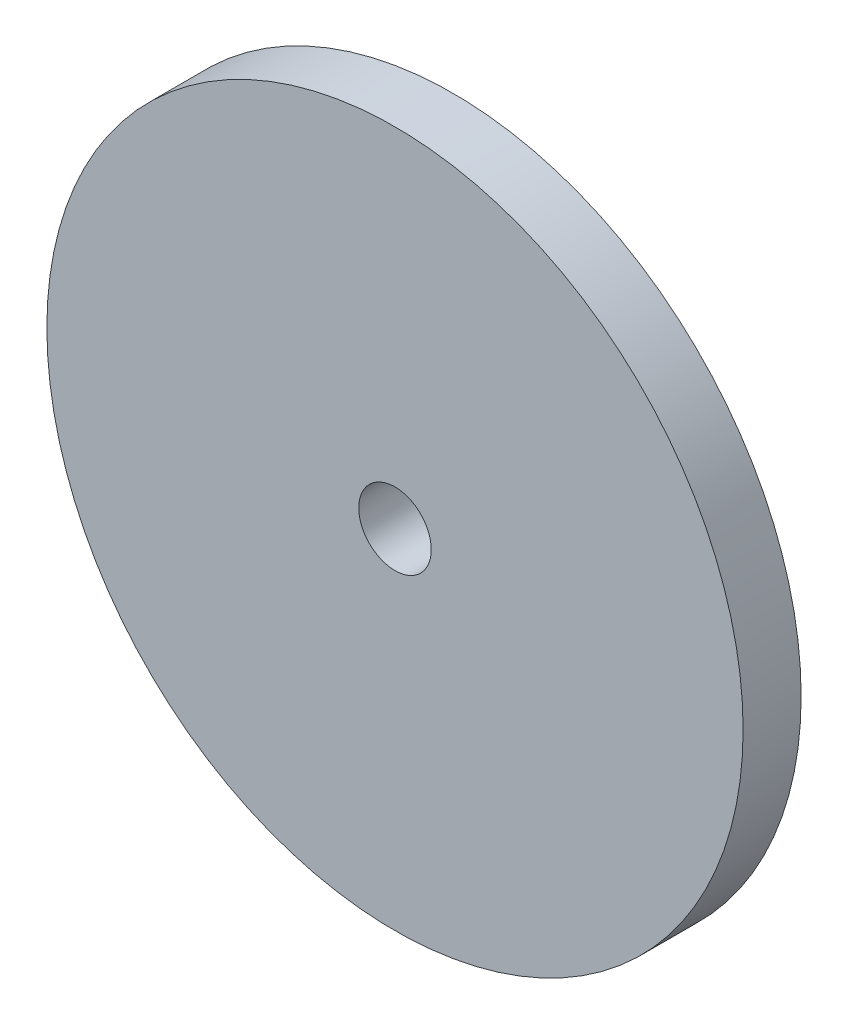
ISO-10303-21;
HEADER;
FILE_DESCRIPTION(('STEP AP214'),'2;1');
FILE_NAME('part.step','',(''),(''),'','','');
FILE_SCHEMA(('AUTOMOTIVE_DESIGN { 1 0 10303 214 1 1 1 1 }'));
ENDSEC;
DATA;
#1=APPLICATION_CONTEXT('core data for automotive mechanical design processes');
#2=APPLICATION_PROTOCOL_DEFINITION('international standard','automotive_design',2000,#1);
#3=PRODUCT_CONTEXT('',#1,'mechanical');
#4=PRODUCT('Part','Part','',(#3));
#5=PRODUCT_RELATED_PRODUCT_CATEGORY('part','',(#4));
#6=PRODUCT_DEFINITION_FORMATION('','',#4);
#7=PRODUCT_DEFINITION_CONTEXT('part definition',#1,'design');
#8=PRODUCT_DEFINITION('design','',#6,#7);
#9=PRODUCT_DEFINITION_SHAPE('','',#8);
#10=(LENGTH_UNIT() NAMED_UNIT(*) SI_UNIT(.MILLI.,.METRE.));
#11=(NAMED_UNIT(*) PLANE_ANGLE_UNIT() SI_UNIT($,.RADIAN.));
#12=(NAMED_UNIT(*) SI_UNIT($,.STERADIAN.) SOLID_ANGLE_UNIT());
#13=UNCERTAINTY_MEASURE_WITH_UNIT(LENGTH_MEASURE(1.E-05),#10,'distance_accuracy_value','');
#14=(GEOMETRIC_REPRESENTATION_CONTEXT(3) GLOBAL_UNCERTAINTY_ASSIGNED_CONTEXT((#13)) GLOBAL_UNIT_ASSIGNED_CONTEXT((#10,
#11,#12)) REPRESENTATION_CONTEXT('',''));
#15=CARTESIAN_POINT('',(0.,0.,0.));
#16=DIRECTION('',(0.,0.,1.));
#17=DIRECTION('',(1.,0.,0.));
#18=AXIS2_PLACEMENT_3D('',#15,#16,#17);
#19=CARTESIAN_POINT('',(0.,0.,5.08));
#20=DIRECTION('',(0.,0.,1.));
#21=DIRECTION('',(1.,0.,0.));
#22=AXIS2_PLACEMENT_3D('',#19,#20,#21);
#23=PLANE('',#22);
#24=CARTESIAN_POINT('',(0.,0.,5.08));
#25=DIRECTION('',(0.,0.,1.));
#26=DIRECTION('',(1.,0.,0.));
#27=AXIS2_PLACEMENT_3D('',#24,#25,#26);
#28=CIRCLE('',#27,30.48);
#29=CARTESIAN_POINT('',(30.48,0.,5.08));
#30=VERTEX_POINT('',#29);
#31=EDGE_CURVE('E10',#30,#30,#28,.T.);
#32=ORIENTED_EDGE('',*,*,#31,.T.);
#33=EDGE_LOOP('',(#32));
#34=FACE_BOUND('',#33,.T.);
#35=CARTESIAN_POINT('',(0.,0.,5.08));
#36=DIRECTION('',(0.,0.,1.));
#37=DIRECTION('',(1.,0.,0.));
#38=AXIS2_PLACEMENT_3D('',#35,#36,#37);
#39=CIRCLE('',#38,3.175);
#40=CARTESIAN_POINT('',(3.175,0.,5.08));
#41=VERTEX_POINT('',#40);
#42=EDGE_CURVE('E39',#41,#41,#39,.T.);
#43=ORIENTED_EDGE('',*,*,#42,.F.);
#44=EDGE_LOOP('',(#43));
#45=FACE_BOUND('',#44,.T.);
#46=ADVANCED_FACE('F28',(#34,#45),#23,.T.);
#47=CARTESIAN_POINT('',(0.,0.,0.));
#48=DIRECTION('',(0.,0.,1.));
#49=DIRECTION('',(1.,0.,0.));
#50=AXIS2_PLACEMENT_3D('',#47,#48,#49);
#51=PLANE('',#50);
#52=CARTESIAN_POINT('',(0.,0.,0.));
#53=DIRECTION('',(0.,0.,1.));
#54=DIRECTION('',(1.,0.,0.));
#55=AXIS2_PLACEMENT_3D('',#52,#53,#54);
#56=CIRCLE('',#55,30.48);
#57=CARTESIAN_POINT('',(30.48,0.,0.));
#58=VERTEX_POINT('',#57);
#59=EDGE_CURVE('E32',#58,#58,#56,.T.);
#60=ORIENTED_EDGE('',*,*,#59,.F.);
#61=EDGE_LOOP('',(#60));
#62=FACE_BOUND('',#61,.T.);
#63=CARTESIAN_POINT('',(0.,0.,0.));
#64=DIRECTION('',(0.,0.,1.));
#65=DIRECTION('',(1.,0.,0.));
#66=AXIS2_PLACEMENT_3D('',#63,#64,#65);
#67=CIRCLE('',#66,3.175);
#68=CARTESIAN_POINT('',(3.175,0.,0.));
#69=VERTEX_POINT('',#68);
#70=EDGE_CURVE('E41',#69,#69,#67,.T.);
#71=ORIENTED_EDGE('',*,*,#70,.T.);
#72=EDGE_LOOP('',(#71));
#73=FACE_BOUND('',#72,.T.);
#74=ADVANCED_FACE('F51',(#62,#73),#51,.F.);
#75=CARTESIAN_POINT('',(0.,0.,5.08));
#76=DIRECTION('',(0.,0.,-1.));
#77=DIRECTION('',(-1.,0.,0.));
#78=AXIS2_PLACEMENT_3D('',#75,#76,#77);
#79=CYLINDRICAL_SURFACE('',#78,30.48);
#80=ORIENTED_EDGE('',*,*,#31,.F.);
#81=EDGE_LOOP('',(#80));
#82=FACE_BOUND('',#81,.T.);
#83=ORIENTED_EDGE('',*,*,#59,.T.);
#84=EDGE_LOOP('',(#83));
#85=FACE_BOUND('',#84,.T.);
#86=ADVANCED_FACE('F30',(#82,#85),#79,.T.);
#87=CARTESIAN_POINT('',(0.,0.,5.08));
#88=DIRECTION('',(0.,0.,-1.));
#89=DIRECTION('',(-1.,0.,0.));
#90=AXIS2_PLACEMENT_3D('',#87,#88,#89);
#91=CYLINDRICAL_SURFACE('',#90,3.175);
#92=ORIENTED_EDGE('',*,*,#42,.T.);
#93=EDGE_LOOP('',(#92));
#94=FACE_BOUND('',#93,.T.);
#95=ORIENTED_EDGE('',*,*,#70,.F.);
#96=EDGE_LOOP('',(#95));
#97=FACE_BOUND('',#96,.T.);
#98=ADVANCED_FACE('F47',(#94,#97),#91,.F.);
#99=CLOSED_SHELL('',(#46,#74,#86,#98));
#100=MANIFOLD_SOLID_BREP('B2',#99);
#101=ADVANCED_BREP_SHAPE_REPRESENTATION('',(#18,#100),#14);
#102=SHAPE_DEFINITION_REPRESENTATION(#9,#101);
ENDSEC;
END-ISO-10303-21;
